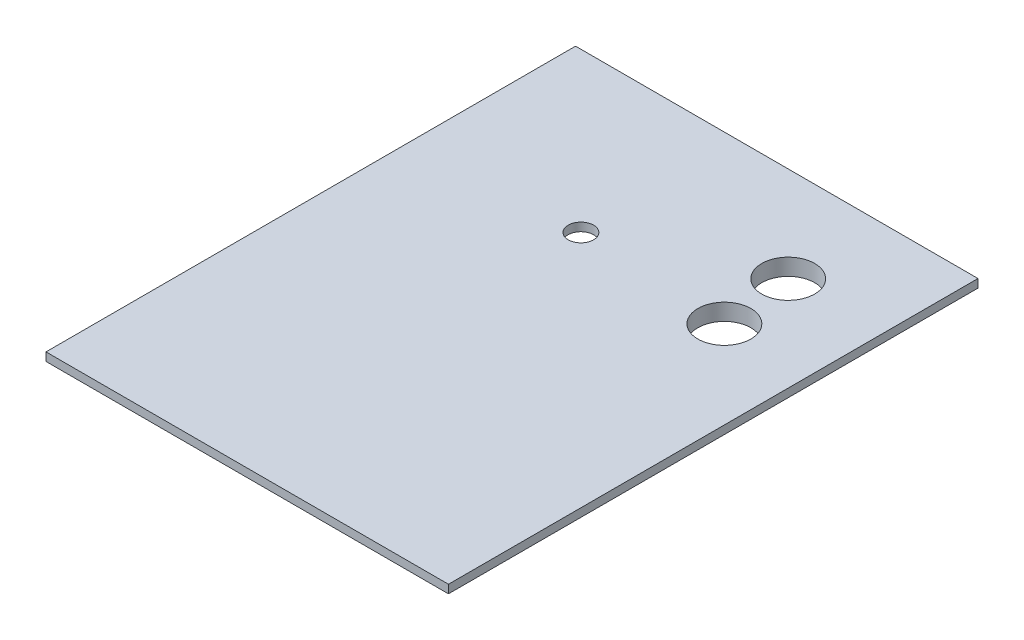
ISO-10303-21;
HEADER;
FILE_DESCRIPTION(('STEP AP214'),'2;1');
FILE_NAME('part.step','',(''),(''),'','','');
FILE_SCHEMA(('AUTOMOTIVE_DESIGN { 1 0 10303 214 1 1 1 1 }'));
ENDSEC;
DATA;
#1=APPLICATION_CONTEXT('core data for automotive mechanical design processes');
#2=APPLICATION_PROTOCOL_DEFINITION('international standard','automotive_design',2000,#1);
#3=PRODUCT_CONTEXT('',#1,'mechanical');
#4=PRODUCT('Part','Part','',(#3));
#5=PRODUCT_RELATED_PRODUCT_CATEGORY('part','',(#4));
#6=PRODUCT_DEFINITION_FORMATION('','',#4);
#7=PRODUCT_DEFINITION_CONTEXT('part definition',#1,'design');
#8=PRODUCT_DEFINITION('design','',#6,#7);
#9=PRODUCT_DEFINITION_SHAPE('','',#8);
#10=(LENGTH_UNIT() NAMED_UNIT(*) SI_UNIT(.MILLI.,.METRE.));
#11=(NAMED_UNIT(*) PLANE_ANGLE_UNIT() SI_UNIT($,.RADIAN.));
#12=(NAMED_UNIT(*) SI_UNIT($,.STERADIAN.) SOLID_ANGLE_UNIT());
#13=UNCERTAINTY_MEASURE_WITH_UNIT(LENGTH_MEASURE(1.E-05),#10,'distance_accuracy_value','');
#14=(GEOMETRIC_REPRESENTATION_CONTEXT(3) GLOBAL_UNCERTAINTY_ASSIGNED_CONTEXT((#13)) GLOBAL_UNIT_ASSIGNED_CONTEXT((#10,
#11,#12)) REPRESENTATION_CONTEXT('',''));
#15=CARTESIAN_POINT('',(0.,0.,0.));
#16=DIRECTION('',(0.,0.,1.));
#17=DIRECTION('',(1.,0.,0.));
#18=AXIS2_PLACEMENT_3D('',#15,#16,#17);
#19=CARTESIAN_POINT('',(0.,-10.3426499702838,0.));
#20=DIRECTION('',(1.,0.,0.));
#21=DIRECTION('',(0.,0.,-1.));
#22=AXIS2_PLACEMENT_3D('',#19,#20,#21);
#23=PLANE('',#22);
#24=DIRECTION('',(0.,0.,1.));
#25=VECTOR('',#24,1.);
#26=CARTESIAN_POINT('',(0.,-11.3426499702838,0.));
#27=LINE('',#26,#25);
#28=CARTESIAN_POINT('',(0.,-11.3426499702838,0.));
#29=VERTEX_POINT('',#28);
#30=CARTESIAN_POINT('',(0.,-11.3426499702843,63.4999999999999));
#31=VERTEX_POINT('',#30);
#32=EDGE_CURVE('E104',#29,#31,#27,.T.);
#33=ORIENTED_EDGE('',*,*,#32,.T.);
#34=DIRECTION('',(0.,-1.,0.));
#35=VECTOR('',#34,1.);
#36=CARTESIAN_POINT('',(0.,-10.3426499702843,63.4999999999999));
#37=LINE('',#36,#35);
#38=CARTESIAN_POINT('',(0.,-10.3426499702843,63.4999999999999));
#39=VERTEX_POINT('',#38);
#40=EDGE_CURVE('E95',#39,#31,#37,.T.);
#41=ORIENTED_EDGE('',*,*,#40,.F.);
#42=DIRECTION('',(0.,0.,1.));
#43=VECTOR('',#42,1.);
#44=CARTESIAN_POINT('',(0.,-10.3426499702838,0.));
#45=LINE('',#44,#43);
#46=CARTESIAN_POINT('',(0.,-10.3426499702838,0.));
#47=VERTEX_POINT('',#46);
#48=EDGE_CURVE('E89',#47,#39,#45,.T.);
#49=ORIENTED_EDGE('',*,*,#48,.F.);
#50=DIRECTION('',(0.,-1.,0.));
#51=VECTOR('',#50,1.);
#52=CARTESIAN_POINT('',(0.,-10.3426499702838,0.));
#53=LINE('',#52,#51);
#54=EDGE_CURVE('E100',#47,#29,#53,.T.);
#55=ORIENTED_EDGE('',*,*,#54,.T.);
#56=EDGE_LOOP('',(#33,#41,#49,#55));
#57=FACE_BOUND('',#56,.T.);
#58=ADVANCED_FACE('F35',(#57),#23,.F.);
#59=CARTESIAN_POINT('',(0.,-10.3426499702843,63.4999999999999));
#60=DIRECTION('',(0.,0.,-1.));
#61=DIRECTION('',(0.,1.,0.));
#62=AXIS2_PLACEMENT_3D('',#59,#60,#61);
#63=PLANE('',#62);
#64=DIRECTION('',(1.,0.,0.));
#65=VECTOR('',#64,1.);
#66=CARTESIAN_POINT('',(0.,-11.3426499702843,63.4999999999999));
#67=LINE('',#66,#65);
#68=CARTESIAN_POINT('',(48.26,-11.3426499702843,63.4999999999999));
#69=VERTEX_POINT('',#68);
#70=EDGE_CURVE('E94',#31,#69,#67,.T.);
#71=ORIENTED_EDGE('',*,*,#70,.T.);
#72=DIRECTION('',(0.,-1.,0.));
#73=VECTOR('',#72,1.);
#74=CARTESIAN_POINT('',(48.26,-10.3426499702843,63.4999999999999));
#75=LINE('',#74,#73);
#76=CARTESIAN_POINT('',(48.26,-10.3426499702843,63.4999999999999));
#77=VERTEX_POINT('',#76);
#78=EDGE_CURVE('E92',#77,#69,#75,.T.);
#79=ORIENTED_EDGE('',*,*,#78,.F.);
#80=DIRECTION('',(1.,0.,0.));
#81=VECTOR('',#80,1.);
#82=CARTESIAN_POINT('',(0.,-10.3426499702843,63.4999999999999));
#83=LINE('',#82,#81);
#84=EDGE_CURVE('E84',#39,#77,#83,.T.);
#85=ORIENTED_EDGE('',*,*,#84,.F.);
#86=ORIENTED_EDGE('',*,*,#40,.T.);
#87=EDGE_LOOP('',(#71,#79,#85,#86));
#88=FACE_BOUND('',#87,.T.);
#89=ADVANCED_FACE('F93',(#88),#63,.F.);
#90=CARTESIAN_POINT('',(48.26,-10.3426499702838,0.));
#91=DIRECTION('',(-1.,0.,0.));
#92=DIRECTION('',(0.,0.,1.));
#93=AXIS2_PLACEMENT_3D('',#90,#91,#92);
#94=PLANE('',#93);
#95=DIRECTION('',(0.,0.,-1.));
#96=VECTOR('',#95,1.);
#97=CARTESIAN_POINT('',(48.26,-11.3426499702838,0.));
#98=LINE('',#97,#96);
#99=CARTESIAN_POINT('',(48.26,-11.3426499702838,0.));
#100=VERTEX_POINT('',#99);
#101=EDGE_CURVE('E70',#69,#100,#98,.T.);
#102=ORIENTED_EDGE('',*,*,#101,.T.);
#103=DIRECTION('',(0.,-1.,0.));
#104=VECTOR('',#103,1.);
#105=CARTESIAN_POINT('',(48.26,-10.3426499702838,0.));
#106=LINE('',#105,#104);
#107=CARTESIAN_POINT('',(48.26,-10.3426499702838,0.));
#108=VERTEX_POINT('',#107);
#109=EDGE_CURVE('E96',#108,#100,#106,.T.);
#110=ORIENTED_EDGE('',*,*,#109,.F.);
#111=DIRECTION('',(0.,0.,-1.));
#112=VECTOR('',#111,1.);
#113=CARTESIAN_POINT('',(48.26,-10.3426499702838,0.));
#114=LINE('',#113,#112);
#115=EDGE_CURVE('E87',#77,#108,#114,.T.);
#116=ORIENTED_EDGE('',*,*,#115,.F.);
#117=ORIENTED_EDGE('',*,*,#78,.T.);
#118=EDGE_LOOP('',(#102,#110,#116,#117));
#119=FACE_BOUND('',#118,.T.);
#120=ADVANCED_FACE('F98',(#119),#94,.F.);
#121=CARTESIAN_POINT('',(0.,-10.3426499702838,0.));
#122=DIRECTION('',(0.,0.,1.));
#123=DIRECTION('',(0.,-1.,0.));
#124=AXIS2_PLACEMENT_3D('',#121,#122,#123);
#125=PLANE('',#124);
#126=DIRECTION('',(-1.,0.,0.));
#127=VECTOR('',#126,1.);
#128=CARTESIAN_POINT('',(0.,-11.3426499702838,0.));
#129=LINE('',#128,#127);
#130=EDGE_CURVE('E76',#100,#29,#129,.T.);
#131=ORIENTED_EDGE('',*,*,#130,.T.);
#132=ORIENTED_EDGE('',*,*,#54,.F.);
#133=DIRECTION('',(-1.,0.,0.));
#134=VECTOR('',#133,1.);
#135=CARTESIAN_POINT('',(0.,-10.3426499702838,0.));
#136=LINE('',#135,#134);
#137=EDGE_CURVE('E53',#108,#47,#136,.T.);
#138=ORIENTED_EDGE('',*,*,#137,.F.);
#139=ORIENTED_EDGE('',*,*,#109,.T.);
#140=EDGE_LOOP('',(#131,#132,#138,#139));
#141=FACE_BOUND('',#140,.T.);
#142=ADVANCED_FACE('F195',(#141),#125,.F.);
#143=CARTESIAN_POINT('',(0.,-10.3426499702838,0.));
#144=DIRECTION('',(0.,1.,0.));
#145=DIRECTION('',(0.,0.,1.));
#146=AXIS2_PLACEMENT_3D('',#143,#144,#145);
#147=PLANE('',#146);
#148=CARTESIAN_POINT('',(19.6723,-10.3426499702835,19.0271399999999));
#149=DIRECTION('',(0.,-1.,0.));
#150=DIRECTION('',(0.,0.,-1.));
#151=AXIS2_PLACEMENT_3D('',#148,#149,#150);
#152=CIRCLE('',#151,1.524);
#153=CARTESIAN_POINT('',(19.6723,-10.3426499702835,17.5031399999999));
#154=VERTEX_POINT('',#153);
#155=EDGE_CURVE('E373',#154,#154,#152,.T.);
#156=ORIENTED_EDGE('',*,*,#155,.T.);
#157=EDGE_LOOP('',(#156));
#158=FACE_BOUND('',#157,.T.);
#159=CARTESIAN_POINT('',(36.9062,-10.3426499702835,11.4045999999999));
#160=DIRECTION('',(0.,-1.,0.));
#161=DIRECTION('',(0.,0.,-1.));
#162=AXIS2_PLACEMENT_3D('',#159,#160,#161);
#163=CIRCLE('',#162,3.175);
#164=CARTESIAN_POINT('',(36.9062,-10.3426499702835,8.22959999999993));
#165=VERTEX_POINT('',#164);
#166=EDGE_CURVE('E374',#165,#165,#163,.T.);
#167=ORIENTED_EDGE('',*,*,#166,.T.);
#168=EDGE_LOOP('',(#167));
#169=FACE_BOUND('',#168,.T.);
#170=CARTESIAN_POINT('',(37.75456,-10.3426499702835,19.9059799999999));
#171=DIRECTION('',(0.,-1.,0.));
#172=DIRECTION('',(0.,0.,-1.));
#173=AXIS2_PLACEMENT_3D('',#170,#171,#172);
#174=CIRCLE('',#173,3.175);
#175=CARTESIAN_POINT('',(37.75456,-10.3426499702835,16.7309799999999));
#176=VERTEX_POINT('',#175);
#177=EDGE_CURVE('E135',#176,#176,#174,.T.);
#178=ORIENTED_EDGE('',*,*,#177,.T.);
#179=EDGE_LOOP('',(#178));
#180=FACE_BOUND('',#179,.T.);
#181=ORIENTED_EDGE('',*,*,#48,.T.);
#182=ORIENTED_EDGE('',*,*,#84,.T.);
#183=ORIENTED_EDGE('',*,*,#115,.T.);
#184=ORIENTED_EDGE('',*,*,#137,.T.);
#185=EDGE_LOOP('',(#181,#182,#183,#184));
#186=FACE_BOUND('',#185,.T.);
#187=ADVANCED_FACE('F85',(#158,#169,#180,#186),#147,.T.);
#188=CARTESIAN_POINT('',(0.,-11.3426499702838,0.));
#189=DIRECTION('',(0.,1.,0.));
#190=DIRECTION('',(0.,0.,1.));
#191=AXIS2_PLACEMENT_3D('',#188,#189,#190);
#192=PLANE('',#191);
#193=CARTESIAN_POINT('',(19.6723,-11.342649970284,19.0271399999999));
#194=DIRECTION('',(0.,1.,0.));
#195=DIRECTION('',(0.,0.,1.));
#196=AXIS2_PLACEMENT_3D('',#193,#194,#195);
#197=CIRCLE('',#196,1.524);
#198=CARTESIAN_POINT('',(19.6723,-11.342649970284,20.5511399999999));
#199=VERTEX_POINT('',#198);
#200=EDGE_CURVE('E38',#199,#199,#197,.T.);
#201=ORIENTED_EDGE('',*,*,#200,.T.);
#202=EDGE_LOOP('',(#201));
#203=FACE_BOUND('',#202,.T.);
#204=CARTESIAN_POINT('',(27.31008,-11.3426499702839,5.72007999999992));
#205=DIRECTION('',(0.,1.,0.));
#206=DIRECTION('',(0.,0.,1.));
#207=AXIS2_PLACEMENT_3D('',#204,#205,#206);
#208=CIRCLE('',#207,2.524);
#209=CARTESIAN_POINT('',(27.31008,-11.3426499702839,8.24407999999992));
#210=VERTEX_POINT('',#209);
#211=EDGE_CURVE('E11',#210,#210,#208,.F.);
#212=ORIENTED_EDGE('',*,*,#211,.F.);
#213=EDGE_LOOP('',(#212));
#214=FACE_BOUND('',#213,.T.);
#215=CARTESIAN_POINT('',(36.9062,-11.3426499702839,11.4045999999999));
#216=DIRECTION('',(0.,1.,0.));
#217=DIRECTION('',(0.,0.,1.));
#218=AXIS2_PLACEMENT_3D('',#215,#216,#217);
#219=CIRCLE('',#218,4.064);
#220=CARTESIAN_POINT('',(36.9062,-11.342649970284,15.4685999999999));
#221=VERTEX_POINT('',#220);
#222=EDGE_CURVE('E44',#221,#221,#219,.F.);
#223=ORIENTED_EDGE('',*,*,#222,.F.);
#224=EDGE_LOOP('',(#223));
#225=FACE_BOUND('',#224,.T.);
#226=CARTESIAN_POINT('',(37.75456,-11.342649970284,19.9059799999999));
#227=DIRECTION('',(0.,1.,0.));
#228=DIRECTION('',(0.,0.,1.));
#229=AXIS2_PLACEMENT_3D('',#226,#227,#228);
#230=CIRCLE('',#229,4.064);
#231=CARTESIAN_POINT('',(37.75456,-11.342649970284,23.9699799999999));
#232=VERTEX_POINT('',#231);
#233=EDGE_CURVE('E122',#232,#232,#230,.F.);
#234=ORIENTED_EDGE('',*,*,#233,.F.);
#235=EDGE_LOOP('',(#234));
#236=FACE_BOUND('',#235,.T.);
#237=CARTESIAN_POINT('',(5.0673,-11.3426499702843,58.3463399999999));
#238=DIRECTION('',(0.,1.,0.));
#239=DIRECTION('',(0.,0.,1.));
#240=AXIS2_PLACEMENT_3D('',#237,#238,#239);
#241=CIRCLE('',#240,2.52400000000002);
#242=CARTESIAN_POINT('',(5.0673,-11.3426499702843,60.8703399999999));
#243=VERTEX_POINT('',#242);
#244=EDGE_CURVE('E114',#243,#243,#241,.F.);
#245=ORIENTED_EDGE('',*,*,#244,.F.);
#246=EDGE_LOOP('',(#245));
#247=FACE_BOUND('',#246,.T.);
#248=ORIENTED_EDGE('',*,*,#32,.F.);
#249=ORIENTED_EDGE('',*,*,#130,.F.);
#250=ORIENTED_EDGE('',*,*,#101,.F.);
#251=ORIENTED_EDGE('',*,*,#70,.F.);
#252=EDGE_LOOP('',(#248,#249,#250,#251));
#253=FACE_BOUND('',#252,.T.);
#254=ADVANCED_FACE('F185',(#203,#214,#225,#236,#247,#253),#192,.F.);
#255=CARTESIAN_POINT('',(5.0673,-12.3426499702843,58.3463399999999));
#256=DIRECTION('',(0.,1.,0.));
#257=DIRECTION('',(0.,0.,1.));
#258=AXIS2_PLACEMENT_3D('',#255,#256,#257);
#259=CYLINDRICAL_SURFACE('',#258,2.52400000000002);
#260=CARTESIAN_POINT('',(5.0673,-12.3426499702843,58.3463399999999));
#261=DIRECTION('',(0.,-1.,0.));
#262=DIRECTION('',(0.,0.,-1.));
#263=AXIS2_PLACEMENT_3D('',#260,#261,#262);
#264=CIRCLE('',#263,2.52400000000002);
#265=CARTESIAN_POINT('',(5.0673,-12.3426499702842,55.8223399999999));
#266=VERTEX_POINT('',#265);
#267=EDGE_CURVE('E119',#266,#266,#264,.T.);
#268=ORIENTED_EDGE('',*,*,#267,.F.);
#269=EDGE_LOOP('',(#268));
#270=FACE_BOUND('',#269,.T.);
#271=ORIENTED_EDGE('',*,*,#244,.T.);
#272=EDGE_LOOP('',(#271));
#273=FACE_BOUND('',#272,.T.);
#274=ADVANCED_FACE('F187',(#270,#273),#259,.T.);
#275=CARTESIAN_POINT('',(5.0673,-12.3426499702843,58.3463399999999));
#276=DIRECTION('',(0.,-1.,0.));
#277=DIRECTION('',(0.,0.,-1.));
#278=AXIS2_PLACEMENT_3D('',#275,#276,#277);
#279=PLANE('',#278);
#280=CARTESIAN_POINT('',(5.0673,-12.3426499702843,58.3463399999999));
#281=DIRECTION('',(0.,-1.,0.));
#282=DIRECTION('',(0.,0.,-1.));
#283=AXIS2_PLACEMENT_3D('',#280,#281,#282);
#284=CIRCLE('',#283,1.143);
#285=CARTESIAN_POINT('',(5.0673,-12.3426499702842,57.2033399999999));
#286=VERTEX_POINT('',#285);
#287=EDGE_CURVE('E115',#286,#286,#284,.T.);
#288=ORIENTED_EDGE('',*,*,#287,.F.);
#289=EDGE_LOOP('',(#288));
#290=FACE_BOUND('',#289,.T.);
#291=ORIENTED_EDGE('',*,*,#267,.T.);
#292=EDGE_LOOP('',(#291));
#293=FACE_BOUND('',#292,.T.);
#294=ADVANCED_FACE('F175',(#290,#293),#279,.T.);
#295=CARTESIAN_POINT('',(5.0673,-14.3426499702843,58.3463399999999));
#296=DIRECTION('',(0.,-1.,0.));
#297=DIRECTION('',(0.,0.,-1.));
#298=AXIS2_PLACEMENT_3D('',#295,#296,#297);
#299=PLANE('',#298);
#300=CARTESIAN_POINT('',(5.0673,-14.3426499702843,58.3463399999999));
#301=DIRECTION('',(0.,-1.,0.));
#302=DIRECTION('',(0.,0.,-1.));
#303=AXIS2_PLACEMENT_3D('',#300,#301,#302);
#304=CIRCLE('',#303,1.143);
#305=CARTESIAN_POINT('',(5.0673,-14.3426499702842,57.2033399999999));
#306=VERTEX_POINT('',#305);
#307=EDGE_CURVE('E107',#306,#306,#304,.T.);
#308=ORIENTED_EDGE('',*,*,#307,.T.);
#309=EDGE_LOOP('',(#308));
#310=FACE_BOUND('',#309,.T.);
#311=ADVANCED_FACE('F161',(#310),#299,.T.);
#312=CARTESIAN_POINT('',(5.0673,-14.3426499702843,58.3463399999999));
#313=DIRECTION('',(0.,1.,0.));
#314=DIRECTION('',(0.,0.,1.));
#315=AXIS2_PLACEMENT_3D('',#312,#313,#314);
#316=CYLINDRICAL_SURFACE('',#315,1.143);
#317=ORIENTED_EDGE('',*,*,#287,.T.);
#318=EDGE_LOOP('',(#317));
#319=FACE_BOUND('',#318,.T.);
#320=ORIENTED_EDGE('',*,*,#307,.F.);
#321=EDGE_LOOP('',(#320));
#322=FACE_BOUND('',#321,.T.);
#323=ADVANCED_FACE('F163',(#319,#322),#316,.T.);
#324=CARTESIAN_POINT('',(37.75456,-12.342649970284,19.9059799999999));
#325=DIRECTION('',(0.,1.,0.));
#326=DIRECTION('',(0.,0.,1.));
#327=AXIS2_PLACEMENT_3D('',#324,#325,#326);
#328=CYLINDRICAL_SURFACE('',#327,4.064);
#329=CARTESIAN_POINT('',(37.75456,-12.342649970284,19.9059799999999));
#330=DIRECTION('',(0.,-1.,0.));
#331=DIRECTION('',(0.,0.,-1.));
#332=AXIS2_PLACEMENT_3D('',#329,#330,#331);
#333=CIRCLE('',#332,4.064);
#334=CARTESIAN_POINT('',(37.75456,-12.342649970284,15.8419799999999));
#335=VERTEX_POINT('',#334);
#336=EDGE_CURVE('E151',#335,#335,#333,.T.);
#337=ORIENTED_EDGE('',*,*,#336,.F.);
#338=EDGE_LOOP('',(#337));
#339=FACE_BOUND('',#338,.T.);
#340=ORIENTED_EDGE('',*,*,#233,.T.);
#341=EDGE_LOOP('',(#340));
#342=FACE_BOUND('',#341,.T.);
#343=ADVANCED_FACE('F165',(#339,#342),#328,.T.);
#344=CARTESIAN_POINT('',(37.75456,-12.342649970284,19.9059799999999));
#345=DIRECTION('',(0.,-1.,0.));
#346=DIRECTION('',(0.,0.,-1.));
#347=AXIS2_PLACEMENT_3D('',#344,#345,#346);
#348=PLANE('',#347);
#349=CARTESIAN_POINT('',(37.75456,-12.342649970284,19.9059799999999));
#350=DIRECTION('',(0.,-1.,0.));
#351=DIRECTION('',(0.,0.,-1.));
#352=AXIS2_PLACEMENT_3D('',#349,#350,#351);
#353=CIRCLE('',#352,3.175);
#354=CARTESIAN_POINT('',(37.75456,-12.342649970284,16.7309799999999));
#355=VERTEX_POINT('',#354);
#356=EDGE_CURVE('E134',#355,#355,#353,.T.);
#357=ORIENTED_EDGE('',*,*,#356,.F.);
#358=EDGE_LOOP('',(#357));
#359=FACE_BOUND('',#358,.T.);
#360=ORIENTED_EDGE('',*,*,#336,.T.);
#361=EDGE_LOOP('',(#360));
#362=FACE_BOUND('',#361,.T.);
#363=ADVANCED_FACE('F172',(#359,#362),#348,.T.);
#364=CARTESIAN_POINT('',(36.9062,-12.3426499702839,11.4045999999999));
#365=DIRECTION('',(0.,1.,0.));
#366=DIRECTION('',(0.,0.,1.));
#367=AXIS2_PLACEMENT_3D('',#364,#365,#366);
#368=CYLINDRICAL_SURFACE('',#367,4.064);
#369=CARTESIAN_POINT('',(36.9062,-12.3426499702839,11.4045999999999));
#370=DIRECTION('',(0.,-1.,0.));
#371=DIRECTION('',(0.,0.,-1.));
#372=AXIS2_PLACEMENT_3D('',#369,#370,#371);
#373=CIRCLE('',#372,4.064);
#374=CARTESIAN_POINT('',(36.9062,-12.3426499702839,7.3405999999999));
#375=VERTEX_POINT('',#374);
#376=EDGE_CURVE('E129',#375,#375,#373,.T.);
#377=ORIENTED_EDGE('',*,*,#376,.F.);
#378=EDGE_LOOP('',(#377));
#379=FACE_BOUND('',#378,.T.);
#380=ORIENTED_EDGE('',*,*,#222,.T.);
#381=EDGE_LOOP('',(#380));
#382=FACE_BOUND('',#381,.T.);
#383=ADVANCED_FACE('F235',(#379,#382),#368,.T.);
#384=CARTESIAN_POINT('',(36.9062,-12.3426499702839,11.4045999999999));
#385=DIRECTION('',(0.,-1.,0.));
#386=DIRECTION('',(0.,0.,-1.));
#387=AXIS2_PLACEMENT_3D('',#384,#385,#386);
#388=PLANE('',#387);
#389=CARTESIAN_POINT('',(36.9062,-12.3426499702839,11.4045999999999));
#390=DIRECTION('',(0.,-1.,0.));
#391=DIRECTION('',(0.,0.,-1.));
#392=AXIS2_PLACEMENT_3D('',#389,#390,#391);
#393=CIRCLE('',#392,3.175);
#394=CARTESIAN_POINT('',(36.9062,-12.3426499702839,8.22959999999991));
#395=VERTEX_POINT('',#394);
#396=EDGE_CURVE('E132',#395,#395,#393,.T.);
#397=ORIENTED_EDGE('',*,*,#396,.F.);
#398=EDGE_LOOP('',(#397));
#399=FACE_BOUND('',#398,.T.);
#400=ORIENTED_EDGE('',*,*,#376,.T.);
#401=EDGE_LOOP('',(#400));
#402=FACE_BOUND('',#401,.T.);
#403=ADVANCED_FACE('F244',(#399,#402),#388,.T.);
#404=CARTESIAN_POINT('',(27.31008,-12.3426499702839,5.72007999999991));
#405=DIRECTION('',(0.,1.,0.));
#406=DIRECTION('',(0.,0.,1.));
#407=AXIS2_PLACEMENT_3D('',#404,#405,#406);
#408=CYLINDRICAL_SURFACE('',#407,2.524);
#409=CARTESIAN_POINT('',(27.31008,-12.3426499702839,5.72007999999991));
#410=DIRECTION('',(0.,-1.,0.));
#411=DIRECTION('',(0.,0.,-1.));
#412=AXIS2_PLACEMENT_3D('',#409,#410,#411);
#413=CIRCLE('',#412,2.524);
#414=CARTESIAN_POINT('',(27.31008,-12.3426499702839,3.19607999999991));
#415=VERTEX_POINT('',#414);
#416=EDGE_CURVE('E130',#415,#415,#413,.T.);
#417=ORIENTED_EDGE('',*,*,#416,.F.);
#418=EDGE_LOOP('',(#417));
#419=FACE_BOUND('',#418,.T.);
#420=ORIENTED_EDGE('',*,*,#211,.T.);
#421=EDGE_LOOP('',(#420));
#422=FACE_BOUND('',#421,.T.);
#423=ADVANCED_FACE('F249',(#419,#422),#408,.T.);
#424=CARTESIAN_POINT('',(27.31008,-12.3426499702839,5.72007999999991));
#425=DIRECTION('',(0.,-1.,0.));
#426=DIRECTION('',(0.,0.,-1.));
#427=AXIS2_PLACEMENT_3D('',#424,#425,#426);
#428=PLANE('',#427);
#429=CARTESIAN_POINT('',(27.31008,-12.3426499702839,5.72007999999991));
#430=DIRECTION('',(0.,-1.,0.));
#431=DIRECTION('',(0.,0.,-1.));
#432=AXIS2_PLACEMENT_3D('',#429,#430,#431);
#433=CIRCLE('',#432,1.143);
#434=CARTESIAN_POINT('',(27.31008,-12.3426499702839,4.57707999999991));
#435=VERTEX_POINT('',#434);
#436=EDGE_CURVE('E127',#435,#435,#433,.T.);
#437=ORIENTED_EDGE('',*,*,#436,.F.);
#438=EDGE_LOOP('',(#437));
#439=FACE_BOUND('',#438,.T.);
#440=ORIENTED_EDGE('',*,*,#416,.T.);
#441=EDGE_LOOP('',(#440));
#442=FACE_BOUND('',#441,.T.);
#443=ADVANCED_FACE('F289',(#439,#442),#428,.T.);
#444=CARTESIAN_POINT('',(27.31008,-14.3426499702839,5.7200799999999));
#445=DIRECTION('',(0.,-1.,0.));
#446=DIRECTION('',(0.,0.,-1.));
#447=AXIS2_PLACEMENT_3D('',#444,#445,#446);
#448=PLANE('',#447);
#449=CARTESIAN_POINT('',(27.31008,-14.3426499702839,5.7200799999999));
#450=DIRECTION('',(0.,-1.,0.));
#451=DIRECTION('',(0.,0.,-1.));
#452=AXIS2_PLACEMENT_3D('',#449,#450,#451);
#453=CIRCLE('',#452,1.143);
#454=CARTESIAN_POINT('',(27.31008,-14.3426499702839,4.5770799999999));
#455=VERTEX_POINT('',#454);
#456=EDGE_CURVE('E118',#455,#455,#453,.T.);
#457=ORIENTED_EDGE('',*,*,#456,.T.);
#458=EDGE_LOOP('',(#457));
#459=FACE_BOUND('',#458,.T.);
#460=ADVANCED_FACE('F292',(#459),#448,.T.);
#461=CARTESIAN_POINT('',(27.31008,-14.3426499702839,5.7200799999999));
#462=DIRECTION('',(0.,1.,0.));
#463=DIRECTION('',(0.,0.,1.));
#464=AXIS2_PLACEMENT_3D('',#461,#462,#463);
#465=CYLINDRICAL_SURFACE('',#464,1.143);
#466=ORIENTED_EDGE('',*,*,#436,.T.);
#467=EDGE_LOOP('',(#466));
#468=FACE_BOUND('',#467,.T.);
#469=ORIENTED_EDGE('',*,*,#456,.F.);
#470=EDGE_LOOP('',(#469));
#471=FACE_BOUND('',#470,.T.);
#472=ADVANCED_FACE('F221',(#468,#471),#465,.T.);
#473=CARTESIAN_POINT('',(36.9062,-10.3426499702835,11.4045999999999));
#474=DIRECTION('',(0.,-1.,0.));
#475=DIRECTION('',(0.,0.,-1.));
#476=AXIS2_PLACEMENT_3D('',#473,#474,#475);
#477=CYLINDRICAL_SURFACE('',#476,3.175);
#478=ORIENTED_EDGE('',*,*,#396,.T.);
#479=EDGE_LOOP('',(#478));
#480=FACE_BOUND('',#479,.T.);
#481=ORIENTED_EDGE('',*,*,#166,.F.);
#482=EDGE_LOOP('',(#481));
#483=FACE_BOUND('',#482,.T.);
#484=ADVANCED_FACE('F257',(#480,#483),#477,.F.);
#485=CARTESIAN_POINT('',(37.75456,-10.3426499702835,19.9059799999999));
#486=DIRECTION('',(0.,-1.,0.));
#487=DIRECTION('',(0.,0.,-1.));
#488=AXIS2_PLACEMENT_3D('',#485,#486,#487);
#489=CYLINDRICAL_SURFACE('',#488,3.175);
#490=ORIENTED_EDGE('',*,*,#356,.T.);
#491=EDGE_LOOP('',(#490));
#492=FACE_BOUND('',#491,.T.);
#493=ORIENTED_EDGE('',*,*,#177,.F.);
#494=EDGE_LOOP('',(#493));
#495=FACE_BOUND('',#494,.T.);
#496=ADVANCED_FACE('F262',(#492,#495),#489,.F.);
#497=CARTESIAN_POINT('',(19.6723,-10.3426499702835,19.0271399999999));
#498=DIRECTION('',(0.,-1.,0.));
#499=DIRECTION('',(0.,0.,-1.));
#500=AXIS2_PLACEMENT_3D('',#497,#498,#499);
#501=CYLINDRICAL_SURFACE('',#500,1.524);
#502=ORIENTED_EDGE('',*,*,#155,.F.);
#503=EDGE_LOOP('',(#502));
#504=FACE_BOUND('',#503,.T.);
#505=ORIENTED_EDGE('',*,*,#200,.F.);
#506=EDGE_LOOP('',(#505));
#507=FACE_BOUND('',#506,.T.);
#508=ADVANCED_FACE('F273',(#504,#507),#501,.F.);
#509=CLOSED_SHELL('',(#58,#89,#120,#142,#187,#254,#274,#294,#311,#323,#343,#363,#383,#403,#423,
#443,#460,#472,#484,#496,#508));
#510=MANIFOLD_SOLID_BREP('B2',#509);
#511=ADVANCED_BREP_SHAPE_REPRESENTATION('',(#18,#510),#14);
#512=SHAPE_DEFINITION_REPRESENTATION(#9,#511);
ENDSEC;
END-ISO-10303-21;
